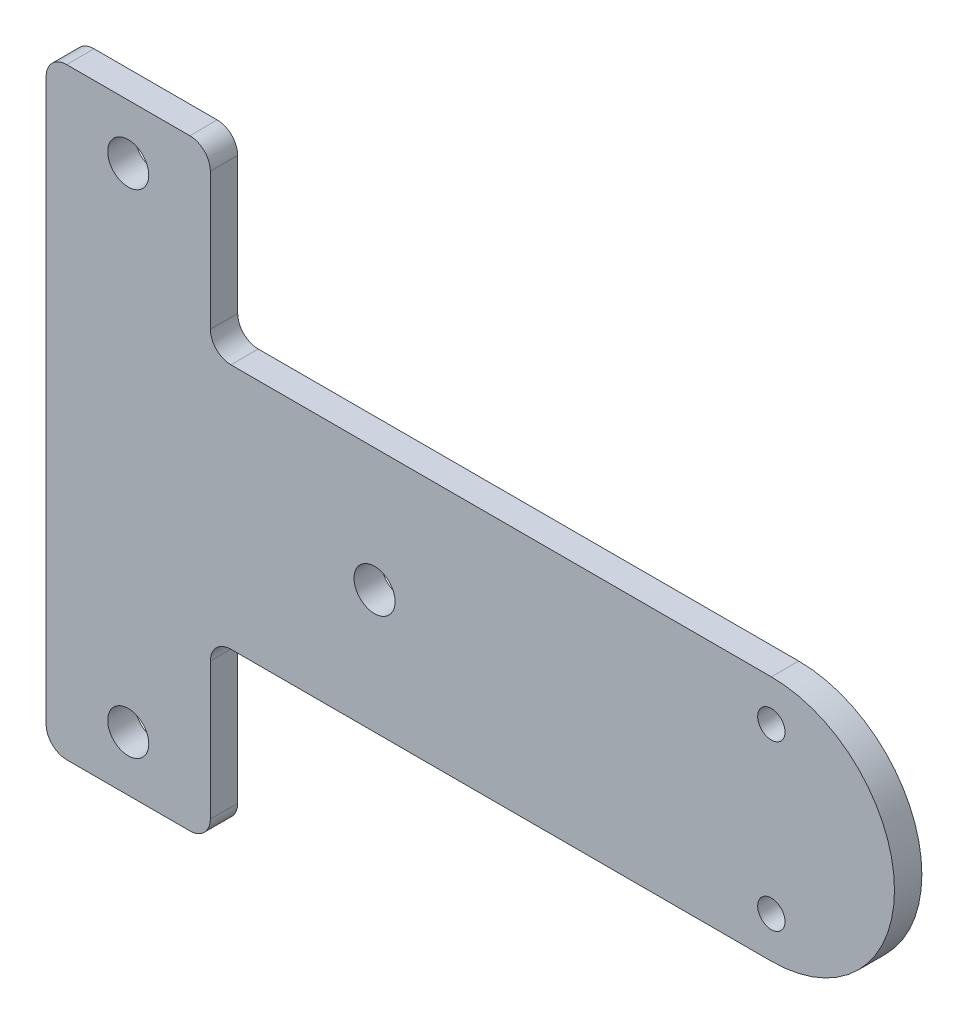
ISO-10303-21;
HEADER;
FILE_DESCRIPTION(('STEP AP214'),'2;1');
FILE_NAME('part.step','',(''),(''),'','','');
FILE_SCHEMA(('AUTOMOTIVE_DESIGN { 1 0 10303 214 1 1 1 1 }'));
ENDSEC;
DATA;
#1=APPLICATION_CONTEXT('core data for automotive mechanical design processes');
#2=APPLICATION_PROTOCOL_DEFINITION('international standard','automotive_design',2000,#1);
#3=PRODUCT_CONTEXT('',#1,'mechanical');
#4=PRODUCT('Part','Part','',(#3));
#5=PRODUCT_RELATED_PRODUCT_CATEGORY('part','',(#4));
#6=PRODUCT_DEFINITION_FORMATION('','',#4);
#7=PRODUCT_DEFINITION_CONTEXT('part definition',#1,'design');
#8=PRODUCT_DEFINITION('design','',#6,#7);
#9=PRODUCT_DEFINITION_SHAPE('','',#8);
#10=(LENGTH_UNIT() NAMED_UNIT(*) SI_UNIT(.MILLI.,.METRE.));
#11=(NAMED_UNIT(*) PLANE_ANGLE_UNIT() SI_UNIT($,.RADIAN.));
#12=(NAMED_UNIT(*) SI_UNIT($,.STERADIAN.) SOLID_ANGLE_UNIT());
#13=UNCERTAINTY_MEASURE_WITH_UNIT(LENGTH_MEASURE(1.E-05),#10,'distance_accuracy_value','');
#14=(GEOMETRIC_REPRESENTATION_CONTEXT(3) GLOBAL_UNCERTAINTY_ASSIGNED_CONTEXT((#13)) GLOBAL_UNIT_ASSIGNED_CONTEXT((#10,
#11,#12)) REPRESENTATION_CONTEXT('',''));
#15=CARTESIAN_POINT('',(0.,0.,0.));
#16=DIRECTION('',(0.,0.,1.));
#17=DIRECTION('',(1.,0.,0.));
#18=AXIS2_PLACEMENT_3D('',#15,#16,#17);
#19=CARTESIAN_POINT('',(-1.72357142857142,-4.3699119953848,2.));
#20=DIRECTION('',(0.,0.,-1.));
#21=DIRECTION('',(-1.,0.,0.));
#22=AXIS2_PLACEMENT_3D('',#19,#20,#21);
#23=CYLINDRICAL_SURFACE('',#22,9.);
#24=CARTESIAN_POINT('',(-1.72357142857142,-4.3699119953848,0.));
#25=DIRECTION('',(0.,0.,1.));
#26=DIRECTION('',(1.,0.,0.));
#27=AXIS2_PLACEMENT_3D('',#24,#25,#26);
#28=CIRCLE('',#27,9.);
#29=CARTESIAN_POINT('',(-1.72357142857142,4.63008800461521,0.));
#30=VERTEX_POINT('',#29);
#31=CARTESIAN_POINT('',(-1.72357142857142,-13.3699119953848,0.));
#32=VERTEX_POINT('',#31);
#33=EDGE_CURVE('E144',#30,#32,#28,.F.);
#34=ORIENTED_EDGE('',*,*,#33,.F.);
#35=DIRECTION('',(0.,0.,-1.));
#36=VECTOR('',#35,1.);
#37=CARTESIAN_POINT('',(-1.72357142857142,4.63008800461521,2.));
#38=LINE('',#37,#36);
#39=CARTESIAN_POINT('',(-1.72357142857142,4.63008800461521,2.));
#40=VERTEX_POINT('',#39);
#41=EDGE_CURVE('E139',#40,#30,#38,.T.);
#42=ORIENTED_EDGE('',*,*,#41,.F.);
#43=CARTESIAN_POINT('',(-1.72357142857142,-4.3699119953848,2.));
#44=DIRECTION('',(0.,0.,1.));
#45=DIRECTION('',(1.,0.,0.));
#46=AXIS2_PLACEMENT_3D('',#43,#44,#45);
#47=CIRCLE('',#46,9.);
#48=CARTESIAN_POINT('',(-1.72357142857142,-13.3699119953848,2.));
#49=VERTEX_POINT('',#48);
#50=EDGE_CURVE('E142',#40,#49,#47,.F.);
#51=ORIENTED_EDGE('',*,*,#50,.T.);
#52=DIRECTION('',(0.,0.,-1.));
#53=VECTOR('',#52,1.);
#54=CARTESIAN_POINT('',(-1.72357142857142,-13.3699119953848,2.));
#55=LINE('',#54,#53);
#56=EDGE_CURVE('E149',#49,#32,#55,.T.);
#57=ORIENTED_EDGE('',*,*,#56,.T.);
#58=EDGE_LOOP('',(#34,#42,#51,#57));
#59=FACE_BOUND('',#58,.T.);
#60=ADVANCED_FACE('F37',(#59),#23,.T.);
#61=CARTESIAN_POINT('',(0.,4.63008800461521,2.));
#62=DIRECTION('',(0.,-1.,0.));
#63=DIRECTION('',(1.,0.,0.));
#64=AXIS2_PLACEMENT_3D('',#61,#62,#63);
#65=PLANE('',#64);
#66=DIRECTION('',(-1.,0.,0.));
#67=VECTOR('',#66,1.);
#68=CARTESIAN_POINT('',(0.,4.63008800461521,0.));
#69=LINE('',#68,#67);
#70=CARTESIAN_POINT('',(-41.2235714285714,4.6300880046152,0.));
#71=VERTEX_POINT('',#70);
#72=EDGE_CURVE('E199',#30,#71,#69,.T.);
#73=ORIENTED_EDGE('',*,*,#72,.T.);
#74=DIRECTION('',(0.,0.,-1.));
#75=VECTOR('',#74,1.);
#76=CARTESIAN_POINT('',(-41.2235714285714,4.6300880046152,2.));
#77=LINE('',#76,#75);
#78=CARTESIAN_POINT('',(-41.2235714285714,4.6300880046152,2.));
#79=VERTEX_POINT('',#78);
#80=EDGE_CURVE('E155',#71,#79,#77,.F.);
#81=ORIENTED_EDGE('',*,*,#80,.T.);
#82=DIRECTION('',(-1.,0.,0.));
#83=VECTOR('',#82,1.);
#84=CARTESIAN_POINT('',(0.,4.63008800461521,2.));
#85=LINE('',#84,#83);
#86=EDGE_CURVE('E152',#40,#79,#85,.T.);
#87=ORIENTED_EDGE('',*,*,#86,.F.);
#88=ORIENTED_EDGE('',*,*,#41,.T.);
#89=EDGE_LOOP('',(#73,#81,#87,#88));
#90=FACE_BOUND('',#89,.T.);
#91=ADVANCED_FACE('F153',(#90),#65,.F.);
#92=CARTESIAN_POINT('',(-42.7235714285714,0.,2.));
#93=DIRECTION('',(-1.,0.,0.));
#94=DIRECTION('',(0.,0.,1.));
#95=AXIS2_PLACEMENT_3D('',#92,#93,#94);
#96=PLANE('',#95);
#97=DIRECTION('',(0.,1.,0.));
#98=VECTOR('',#97,1.);
#99=CARTESIAN_POINT('',(-42.7235714285714,0.,0.));
#100=LINE('',#99,#98);
#101=CARTESIAN_POINT('',(-42.7235714285714,6.1300880046152,0.));
#102=VERTEX_POINT('',#101);
#103=CARTESIAN_POINT('',(-42.7235714285714,16.1300880046152,0.));
#104=VERTEX_POINT('',#103);
#105=EDGE_CURVE('E201',#102,#104,#100,.T.);
#106=ORIENTED_EDGE('',*,*,#105,.T.);
#107=DIRECTION('',(0.,0.,-1.));
#108=VECTOR('',#107,1.);
#109=CARTESIAN_POINT('',(-42.7235714285714,16.1300880046152,2.));
#110=LINE('',#109,#108);
#111=CARTESIAN_POINT('',(-42.7235714285714,16.1300880046152,2.));
#112=VERTEX_POINT('',#111);
#113=EDGE_CURVE('E256',#104,#112,#110,.F.);
#114=ORIENTED_EDGE('',*,*,#113,.T.);
#115=DIRECTION('',(0.,1.,0.));
#116=VECTOR('',#115,1.);
#117=CARTESIAN_POINT('',(-42.7235714285714,0.,2.));
#118=LINE('',#117,#116);
#119=CARTESIAN_POINT('',(-42.7235714285714,6.1300880046152,2.));
#120=VERTEX_POINT('',#119);
#121=EDGE_CURVE('E157',#120,#112,#118,.T.);
#122=ORIENTED_EDGE('',*,*,#121,.F.);
#123=DIRECTION('',(0.,0.,-1.));
#124=VECTOR('',#123,1.);
#125=CARTESIAN_POINT('',(-42.7235714285714,6.1300880046152,0.));
#126=LINE('',#125,#124);
#127=EDGE_CURVE('E253',#120,#102,#126,.T.);
#128=ORIENTED_EDGE('',*,*,#127,.T.);
#129=EDGE_LOOP('',(#106,#114,#122,#128));
#130=FACE_BOUND('',#129,.T.);
#131=ADVANCED_FACE('F294',(#130),#96,.F.);
#132=CARTESIAN_POINT('',(0.,17.6300880046152,2.));
#133=DIRECTION('',(0.,-1.,0.));
#134=DIRECTION('',(0.,0.,-1.));
#135=AXIS2_PLACEMENT_3D('',#132,#133,#134);
#136=PLANE('',#135);
#137=DIRECTION('',(-1.,0.,0.));
#138=VECTOR('',#137,1.);
#139=CARTESIAN_POINT('',(0.,17.6300880046152,0.));
#140=LINE('',#139,#138);
#141=CARTESIAN_POINT('',(-44.2235714285714,17.6300880046152,0.));
#142=VERTEX_POINT('',#141);
#143=CARTESIAN_POINT('',(-53.2235714285714,17.6300880046152,0.));
#144=VERTEX_POINT('',#143);
#145=EDGE_CURVE('E204',#142,#144,#140,.T.);
#146=ORIENTED_EDGE('',*,*,#145,.T.);
#147=DIRECTION('',(0.,0.,-1.));
#148=VECTOR('',#147,1.);
#149=CARTESIAN_POINT('',(-53.2235714285714,17.6300880046152,2.));
#150=LINE('',#149,#148);
#151=CARTESIAN_POINT('',(-53.2235714285714,17.6300880046152,2.));
#152=VERTEX_POINT('',#151);
#153=EDGE_CURVE('E243',#144,#152,#150,.F.);
#154=ORIENTED_EDGE('',*,*,#153,.T.);
#155=DIRECTION('',(-1.,0.,0.));
#156=VECTOR('',#155,1.);
#157=CARTESIAN_POINT('',(0.,17.6300880046152,2.));
#158=LINE('',#157,#156);
#159=CARTESIAN_POINT('',(-44.2235714285714,17.6300880046152,2.));
#160=VERTEX_POINT('',#159);
#161=EDGE_CURVE('E172',#160,#152,#158,.T.);
#162=ORIENTED_EDGE('',*,*,#161,.F.);
#163=DIRECTION('',(0.,0.,-1.));
#164=VECTOR('',#163,1.);
#165=CARTESIAN_POINT('',(-44.2235714285714,17.6300880046152,2.));
#166=LINE('',#165,#164);
#167=EDGE_CURVE('E240',#160,#142,#166,.T.);
#168=ORIENTED_EDGE('',*,*,#167,.T.);
#169=EDGE_LOOP('',(#146,#154,#162,#168));
#170=FACE_BOUND('',#169,.T.);
#171=ADVANCED_FACE('F302',(#170),#136,.F.);
#172=CARTESIAN_POINT('',(-54.7235714285714,0.,2.));
#173=DIRECTION('',(1.,0.,0.));
#174=DIRECTION('',(0.,0.,-1.));
#175=AXIS2_PLACEMENT_3D('',#172,#173,#174);
#176=PLANE('',#175);
#177=DIRECTION('',(0.,-1.,0.));
#178=VECTOR('',#177,1.);
#179=CARTESIAN_POINT('',(-54.7235714285714,0.,2.));
#180=LINE('',#179,#178);
#181=CARTESIAN_POINT('',(-54.7235714285714,16.1300880046152,2.));
#182=VERTEX_POINT('',#181);
#183=CARTESIAN_POINT('',(-54.7235714285714,-24.8699119953848,2.));
#184=VERTEX_POINT('',#183);
#185=EDGE_CURVE('E174',#182,#184,#180,.T.);
#186=ORIENTED_EDGE('',*,*,#185,.F.);
#187=DIRECTION('',(0.,0.,-1.));
#188=VECTOR('',#187,1.);
#189=CARTESIAN_POINT('',(-54.7235714285714,16.1300880046152,2.));
#190=LINE('',#189,#188);
#191=CARTESIAN_POINT('',(-54.7235714285714,16.1300880046152,0.));
#192=VERTEX_POINT('',#191);
#193=EDGE_CURVE('E229',#182,#192,#190,.T.);
#194=ORIENTED_EDGE('',*,*,#193,.T.);
#195=DIRECTION('',(0.,-1.,0.));
#196=VECTOR('',#195,1.);
#197=CARTESIAN_POINT('',(-54.7235714285714,0.,0.));
#198=LINE('',#197,#196);
#199=CARTESIAN_POINT('',(-54.7235714285714,-24.8699119953848,0.));
#200=VERTEX_POINT('',#199);
#201=EDGE_CURVE('E207',#192,#200,#198,.T.);
#202=ORIENTED_EDGE('',*,*,#201,.T.);
#203=DIRECTION('',(0.,0.,-1.));
#204=VECTOR('',#203,1.);
#205=CARTESIAN_POINT('',(-54.7235714285714,-24.8699119953848,2.));
#206=LINE('',#205,#204);
#207=EDGE_CURVE('E148',#200,#184,#206,.F.);
#208=ORIENTED_EDGE('',*,*,#207,.T.);
#209=EDGE_LOOP('',(#186,#194,#202,#208));
#210=FACE_BOUND('',#209,.T.);
#211=ADVANCED_FACE('F311',(#210),#176,.F.);
#212=CARTESIAN_POINT('',(0.,-26.3699119953848,2.));
#213=DIRECTION('',(0.,1.,0.));
#214=DIRECTION('',(0.,0.,1.));
#215=AXIS2_PLACEMENT_3D('',#212,#213,#214);
#216=PLANE('',#215);
#217=DIRECTION('',(1.,0.,0.));
#218=VECTOR('',#217,1.);
#219=CARTESIAN_POINT('',(0.,-26.3699119953848,0.));
#220=LINE('',#219,#218);
#221=CARTESIAN_POINT('',(-53.2235714285714,-26.3699119953848,0.));
#222=VERTEX_POINT('',#221);
#223=CARTESIAN_POINT('',(-44.2235714285714,-26.3699119953848,0.));
#224=VERTEX_POINT('',#223);
#225=EDGE_CURVE('E210',#222,#224,#220,.T.);
#226=ORIENTED_EDGE('',*,*,#225,.T.);
#227=DIRECTION('',(0.,0.,-1.));
#228=VECTOR('',#227,1.);
#229=CARTESIAN_POINT('',(-44.2235714285714,-26.3699119953848,2.));
#230=LINE('',#229,#228);
#231=CARTESIAN_POINT('',(-44.2235714285714,-26.3699119953848,2.));
#232=VERTEX_POINT('',#231);
#233=EDGE_CURVE('E269',#224,#232,#230,.F.);
#234=ORIENTED_EDGE('',*,*,#233,.T.);
#235=DIRECTION('',(1.,0.,0.));
#236=VECTOR('',#235,1.);
#237=CARTESIAN_POINT('',(0.,-26.3699119953848,2.));
#238=LINE('',#237,#236);
#239=CARTESIAN_POINT('',(-53.2235714285714,-26.3699119953848,2.));
#240=VERTEX_POINT('',#239);
#241=EDGE_CURVE('E177',#240,#232,#238,.T.);
#242=ORIENTED_EDGE('',*,*,#241,.F.);
#243=DIRECTION('',(0.,0.,-1.));
#244=VECTOR('',#243,1.);
#245=CARTESIAN_POINT('',(-53.2235714285714,-26.3699119953848,2.));
#246=LINE('',#245,#244);
#247=EDGE_CURVE('E266',#240,#222,#246,.T.);
#248=ORIENTED_EDGE('',*,*,#247,.T.);
#249=EDGE_LOOP('',(#226,#234,#242,#248));
#250=FACE_BOUND('',#249,.T.);
#251=ADVANCED_FACE('F318',(#250),#216,.F.);
#252=CARTESIAN_POINT('',(-42.7235714285714,0.,2.));
#253=DIRECTION('',(-1.,0.,0.));
#254=DIRECTION('',(0.,-1.,0.));
#255=AXIS2_PLACEMENT_3D('',#252,#253,#254);
#256=PLANE('',#255);
#257=DIRECTION('',(0.,1.,0.));
#258=VECTOR('',#257,1.);
#259=CARTESIAN_POINT('',(-42.7235714285714,0.,0.));
#260=LINE('',#259,#258);
#261=CARTESIAN_POINT('',(-42.7235714285714,-24.8699119953848,0.));
#262=VERTEX_POINT('',#261);
#263=CARTESIAN_POINT('',(-42.7235714285714,-14.8699119953848,0.));
#264=VERTEX_POINT('',#263);
#265=EDGE_CURVE('E213',#262,#264,#260,.T.);
#266=ORIENTED_EDGE('',*,*,#265,.T.);
#267=DIRECTION('',(0.,0.,-1.));
#268=VECTOR('',#267,1.);
#269=CARTESIAN_POINT('',(-42.7235714285714,-14.8699119953848,2.));
#270=LINE('',#269,#268);
#271=CARTESIAN_POINT('',(-42.7235714285714,-14.8699119953848,2.));
#272=VERTEX_POINT('',#271);
#273=EDGE_CURVE('E58',#264,#272,#270,.F.);
#274=ORIENTED_EDGE('',*,*,#273,.T.);
#275=DIRECTION('',(0.,1.,0.));
#276=VECTOR('',#275,1.);
#277=CARTESIAN_POINT('',(-42.7235714285714,0.,2.));
#278=LINE('',#277,#276);
#279=CARTESIAN_POINT('',(-42.7235714285714,-24.8699119953848,2.));
#280=VERTEX_POINT('',#279);
#281=EDGE_CURVE('E180',#280,#272,#278,.T.);
#282=ORIENTED_EDGE('',*,*,#281,.F.);
#283=DIRECTION('',(0.,0.,-1.));
#284=VECTOR('',#283,1.);
#285=CARTESIAN_POINT('',(-42.7235714285714,-24.8699119953848,2.));
#286=LINE('',#285,#284);
#287=EDGE_CURVE('E262',#280,#262,#286,.T.);
#288=ORIENTED_EDGE('',*,*,#287,.T.);
#289=EDGE_LOOP('',(#266,#274,#282,#288));
#290=FACE_BOUND('',#289,.T.);
#291=ADVANCED_FACE('F282',(#290),#256,.F.);
#292=CARTESIAN_POINT('',(-48.7235714285714,13.6300880046152,2.));
#293=DIRECTION('',(0.,0.,-1.));
#294=DIRECTION('',(-1.,0.,0.));
#295=AXIS2_PLACEMENT_3D('',#292,#293,#294);
#296=CYLINDRICAL_SURFACE('',#295,1.5);
#297=CARTESIAN_POINT('',(-48.7235714285714,13.6300880046152,2.));
#298=DIRECTION('',(0.,0.,1.));
#299=DIRECTION('',(1.,0.,0.));
#300=AXIS2_PLACEMENT_3D('',#297,#298,#299);
#301=CIRCLE('',#300,1.5);
#302=CARTESIAN_POINT('',(-47.2235714285714,13.6300880046152,2.));
#303=VERTEX_POINT('',#302);
#304=EDGE_CURVE('E186',#303,#303,#301,.T.);
#305=ORIENTED_EDGE('',*,*,#304,.T.);
#306=EDGE_LOOP('',(#305));
#307=FACE_BOUND('',#306,.T.);
#308=CARTESIAN_POINT('',(-48.7235714285714,13.6300880046152,0.));
#309=DIRECTION('',(0.,0.,1.));
#310=DIRECTION('',(1.,0.,0.));
#311=AXIS2_PLACEMENT_3D('',#308,#309,#310);
#312=CIRCLE('',#311,1.5);
#313=CARTESIAN_POINT('',(-47.2235714285714,13.6300880046152,0.));
#314=VERTEX_POINT('',#313);
#315=EDGE_CURVE('E221',#314,#314,#312,.T.);
#316=ORIENTED_EDGE('',*,*,#315,.F.);
#317=EDGE_LOOP('',(#316));
#318=FACE_BOUND('',#317,.T.);
#319=ADVANCED_FACE('F434',(#307,#318),#296,.F.);
#320=CARTESIAN_POINT('',(-30.7235714285714,-4.3699119953848,2.));
#321=DIRECTION('',(0.,0.,-1.));
#322=DIRECTION('',(-1.,0.,0.));
#323=AXIS2_PLACEMENT_3D('',#320,#321,#322);
#324=CYLINDRICAL_SURFACE('',#323,1.5);
#325=CARTESIAN_POINT('',(-30.7235714285714,-4.3699119953848,2.));
#326=DIRECTION('',(0.,0.,1.));
#327=DIRECTION('',(1.,0.,0.));
#328=AXIS2_PLACEMENT_3D('',#325,#326,#327);
#329=CIRCLE('',#328,1.5);
#330=CARTESIAN_POINT('',(-29.2235714285714,-4.3699119953848,2.));
#331=VERTEX_POINT('',#330);
#332=EDGE_CURVE('E183',#331,#331,#329,.T.);
#333=ORIENTED_EDGE('',*,*,#332,.T.);
#334=EDGE_LOOP('',(#333));
#335=FACE_BOUND('',#334,.T.);
#336=CARTESIAN_POINT('',(-30.7235714285714,-4.3699119953848,0.));
#337=DIRECTION('',(0.,0.,1.));
#338=DIRECTION('',(1.,0.,0.));
#339=AXIS2_PLACEMENT_3D('',#336,#337,#338);
#340=CIRCLE('',#339,1.5);
#341=CARTESIAN_POINT('',(-29.2235714285714,-4.3699119953848,0.));
#342=VERTEX_POINT('',#341);
#343=EDGE_CURVE('E218',#342,#342,#340,.T.);
#344=ORIENTED_EDGE('',*,*,#343,.F.);
#345=EDGE_LOOP('',(#344));
#346=FACE_BOUND('',#345,.T.);
#347=ADVANCED_FACE('F426',(#335,#346),#324,.F.);
#348=CARTESIAN_POINT('',(0.,-13.3699119953848,2.));
#349=DIRECTION('',(0.,-1.,0.));
#350=DIRECTION('',(1.,0.,0.));
#351=AXIS2_PLACEMENT_3D('',#348,#349,#350);
#352=PLANE('',#351);
#353=DIRECTION('',(-1.,0.,0.));
#354=VECTOR('',#353,1.);
#355=CARTESIAN_POINT('',(0.,-13.3699119953848,2.));
#356=LINE('',#355,#354);
#357=CARTESIAN_POINT('',(-41.2235714285714,-13.3699119953848,2.));
#358=VERTEX_POINT('',#357);
#359=EDGE_CURVE('E162',#49,#358,#356,.T.);
#360=ORIENTED_EDGE('',*,*,#359,.T.);
#361=DIRECTION('',(0.,0.,-1.));
#362=VECTOR('',#361,1.);
#363=CARTESIAN_POINT('',(-41.2235714285714,-13.3699119953848,2.));
#364=LINE('',#363,#362);
#365=CARTESIAN_POINT('',(-41.2235714285714,-13.3699119953848,0.));
#366=VERTEX_POINT('',#365);
#367=EDGE_CURVE('E259',#358,#366,#364,.T.);
#368=ORIENTED_EDGE('',*,*,#367,.T.);
#369=DIRECTION('',(-1.,0.,0.));
#370=VECTOR('',#369,1.);
#371=CARTESIAN_POINT('',(0.,-13.3699119953848,0.));
#372=LINE('',#371,#370);
#373=EDGE_CURVE('E215',#32,#366,#372,.T.);
#374=ORIENTED_EDGE('',*,*,#373,.F.);
#375=ORIENTED_EDGE('',*,*,#56,.F.);
#376=EDGE_LOOP('',(#360,#368,#374,#375));
#377=FACE_BOUND('',#376,.T.);
#378=ADVANCED_FACE('F286',(#377),#352,.T.);
#379=CARTESIAN_POINT('',(-1.72357142857141,-10.3699119953848,2.));
#380=DIRECTION('',(0.,0.,-1.));
#381=DIRECTION('',(-1.,0.,0.));
#382=AXIS2_PLACEMENT_3D('',#379,#380,#381);
#383=CYLINDRICAL_SURFACE('',#382,1.);
#384=CARTESIAN_POINT('',(-1.72357142857141,-10.3699119953848,2.));
#385=DIRECTION('',(0.,0.,1.));
#386=DIRECTION('',(1.,0.,0.));
#387=AXIS2_PLACEMENT_3D('',#384,#385,#386);
#388=CIRCLE('',#387,1.);
#389=CARTESIAN_POINT('',(-0.723571428571409,-10.3699119953848,2.));
#390=VERTEX_POINT('',#389);
#391=EDGE_CURVE('E163',#390,#390,#388,.T.);
#392=ORIENTED_EDGE('',*,*,#391,.T.);
#393=EDGE_LOOP('',(#392));
#394=FACE_BOUND('',#393,.T.);
#395=CARTESIAN_POINT('',(-1.72357142857141,-10.3699119953848,0.));
#396=DIRECTION('',(0.,0.,1.));
#397=DIRECTION('',(1.,0.,0.));
#398=AXIS2_PLACEMENT_3D('',#395,#396,#397);
#399=CIRCLE('',#398,1.);
#400=CARTESIAN_POINT('',(-0.723571428571409,-10.3699119953848,0.));
#401=VERTEX_POINT('',#400);
#402=EDGE_CURVE('E195',#401,#401,#399,.T.);
#403=ORIENTED_EDGE('',*,*,#402,.F.);
#404=EDGE_LOOP('',(#403));
#405=FACE_BOUND('',#404,.T.);
#406=ADVANCED_FACE('F337',(#394,#405),#383,.F.);
#407=CARTESIAN_POINT('',(-1.72357142857142,1.63008800461521,2.));
#408=DIRECTION('',(0.,0.,-1.));
#409=DIRECTION('',(-1.,0.,0.));
#410=AXIS2_PLACEMENT_3D('',#407,#408,#409);
#411=CYLINDRICAL_SURFACE('',#410,0.999999999999998);
#412=CARTESIAN_POINT('',(-1.72357142857142,1.63008800461521,2.));
#413=DIRECTION('',(0.,0.,1.));
#414=DIRECTION('',(1.,0.,0.));
#415=AXIS2_PLACEMENT_3D('',#412,#413,#414);
#416=CIRCLE('',#415,0.999999999999998);
#417=CARTESIAN_POINT('',(-0.72357142857142,1.63008800461521,2.));
#418=VERTEX_POINT('',#417);
#419=EDGE_CURVE('E166',#418,#418,#416,.T.);
#420=ORIENTED_EDGE('',*,*,#419,.T.);
#421=EDGE_LOOP('',(#420));
#422=FACE_BOUND('',#421,.T.);
#423=CARTESIAN_POINT('',(-1.72357142857142,1.63008800461521,0.));
#424=DIRECTION('',(0.,0.,1.));
#425=DIRECTION('',(1.,0.,0.));
#426=AXIS2_PLACEMENT_3D('',#423,#424,#425);
#427=CIRCLE('',#426,0.999999999999998);
#428=CARTESIAN_POINT('',(-0.72357142857142,1.63008800461521,0.));
#429=VERTEX_POINT('',#428);
#430=EDGE_CURVE('E192',#429,#429,#427,.T.);
#431=ORIENTED_EDGE('',*,*,#430,.F.);
#432=EDGE_LOOP('',(#431));
#433=FACE_BOUND('',#432,.T.);
#434=ADVANCED_FACE('F340',(#422,#433),#411,.F.);
#435=CARTESIAN_POINT('',(-48.7235714285714,-22.3699119953848,2.));
#436=DIRECTION('',(0.,0.,-1.));
#437=DIRECTION('',(-1.,0.,0.));
#438=AXIS2_PLACEMENT_3D('',#435,#436,#437);
#439=CYLINDRICAL_SURFACE('',#438,1.5);
#440=CARTESIAN_POINT('',(-48.7235714285714,-22.3699119953848,2.));
#441=DIRECTION('',(0.,0.,1.));
#442=DIRECTION('',(1.,0.,0.));
#443=AXIS2_PLACEMENT_3D('',#440,#441,#442);
#444=CIRCLE('',#443,1.5);
#445=CARTESIAN_POINT('',(-47.2235714285714,-22.3699119953848,2.));
#446=VERTEX_POINT('',#445);
#447=EDGE_CURVE('E189',#446,#446,#444,.F.);
#448=ORIENTED_EDGE('',*,*,#447,.F.);
#449=EDGE_LOOP('',(#448));
#450=FACE_BOUND('',#449,.T.);
#451=CARTESIAN_POINT('',(-48.7235714285714,-22.3699119953848,0.));
#452=DIRECTION('',(0.,0.,1.));
#453=DIRECTION('',(1.,0.,0.));
#454=AXIS2_PLACEMENT_3D('',#451,#452,#453);
#455=CIRCLE('',#454,1.5);
#456=CARTESIAN_POINT('',(-47.2235714285714,-22.3699119953848,0.));
#457=VERTEX_POINT('',#456);
#458=EDGE_CURVE('E224',#457,#457,#455,.F.);
#459=ORIENTED_EDGE('',*,*,#458,.T.);
#460=EDGE_LOOP('',(#459));
#461=FACE_BOUND('',#460,.T.);
#462=ADVANCED_FACE('F344',(#450,#461),#439,.F.);
#463=CARTESIAN_POINT('',(0.,0.,2.));
#464=DIRECTION('',(0.,0.,1.));
#465=DIRECTION('',(1.,0.,0.));
#466=AXIS2_PLACEMENT_3D('',#463,#464,#465);
#467=PLANE('',#466);
#468=ORIENTED_EDGE('',*,*,#419,.F.);
#469=EDGE_LOOP('',(#468));
#470=FACE_BOUND('',#469,.T.);
#471=ORIENTED_EDGE('',*,*,#391,.F.);
#472=EDGE_LOOP('',(#471));
#473=FACE_BOUND('',#472,.T.);
#474=ORIENTED_EDGE('',*,*,#161,.T.);
#475=CARTESIAN_POINT('',(-53.2235714285714,16.1300880046152,2.));
#476=DIRECTION('',(0.,0.,1.));
#477=DIRECTION('',(1.,0.,0.));
#478=AXIS2_PLACEMENT_3D('',#475,#476,#477);
#479=CIRCLE('',#478,1.5);
#480=EDGE_CURVE('E251',#152,#182,#479,.T.);
#481=ORIENTED_EDGE('',*,*,#480,.T.);
#482=ORIENTED_EDGE('',*,*,#185,.T.);
#483=CARTESIAN_POINT('',(-53.2235714285714,-24.8699119953848,2.));
#484=DIRECTION('',(0.,0.,1.));
#485=DIRECTION('',(1.,0.,0.));
#486=AXIS2_PLACEMENT_3D('',#483,#484,#485);
#487=CIRCLE('',#486,1.5);
#488=EDGE_CURVE('E245',#184,#240,#487,.T.);
#489=ORIENTED_EDGE('',*,*,#488,.T.);
#490=ORIENTED_EDGE('',*,*,#241,.T.);
#491=CARTESIAN_POINT('',(-44.2235714285714,-24.8699119953848,2.));
#492=DIRECTION('',(0.,0.,1.));
#493=DIRECTION('',(1.,0.,0.));
#494=AXIS2_PLACEMENT_3D('',#491,#492,#493);
#495=CIRCLE('',#494,1.5);
#496=EDGE_CURVE('E247',#232,#280,#495,.T.);
#497=ORIENTED_EDGE('',*,*,#496,.T.);
#498=ORIENTED_EDGE('',*,*,#281,.T.);
#499=CARTESIAN_POINT('',(-41.2235714285714,-14.8699119953848,2.));
#500=DIRECTION('',(0.,0.,1.));
#501=DIRECTION('',(1.,0.,0.));
#502=AXIS2_PLACEMENT_3D('',#499,#500,#501);
#503=CIRCLE('',#502,1.5);
#504=EDGE_CURVE('E11',#272,#358,#503,.F.);
#505=ORIENTED_EDGE('',*,*,#504,.T.);
#506=ORIENTED_EDGE('',*,*,#359,.F.);
#507=ORIENTED_EDGE('',*,*,#50,.F.);
#508=ORIENTED_EDGE('',*,*,#86,.T.);
#509=CARTESIAN_POINT('',(-41.2235714285714,6.1300880046152,2.));
#510=DIRECTION('',(0.,0.,1.));
#511=DIRECTION('',(1.,0.,0.));
#512=AXIS2_PLACEMENT_3D('',#509,#510,#511);
#513=CIRCLE('',#512,1.5);
#514=EDGE_CURVE('E273',#79,#120,#513,.F.);
#515=ORIENTED_EDGE('',*,*,#514,.T.);
#516=ORIENTED_EDGE('',*,*,#121,.T.);
#517=CARTESIAN_POINT('',(-44.2235714285714,16.1300880046152,2.));
#518=DIRECTION('',(0.,0.,1.));
#519=DIRECTION('',(1.,0.,0.));
#520=AXIS2_PLACEMENT_3D('',#517,#518,#519);
#521=CIRCLE('',#520,1.5);
#522=EDGE_CURVE('E249',#112,#160,#521,.T.);
#523=ORIENTED_EDGE('',*,*,#522,.T.);
#524=EDGE_LOOP('',(#474,#481,#482,#489,#490,#497,#498,#505,#506,#507,#508,#515,#516,#523));
#525=FACE_BOUND('',#524,.T.);
#526=ORIENTED_EDGE('',*,*,#332,.F.);
#527=EDGE_LOOP('',(#526));
#528=FACE_BOUND('',#527,.T.);
#529=ORIENTED_EDGE('',*,*,#304,.F.);
#530=EDGE_LOOP('',(#529));
#531=FACE_BOUND('',#530,.T.);
#532=ORIENTED_EDGE('',*,*,#447,.T.);
#533=EDGE_LOOP('',(#532));
#534=FACE_BOUND('',#533,.T.);
#535=ADVANCED_FACE('F160',(#470,#473,#525,#528,#531,#534),#467,.T.);
#536=CARTESIAN_POINT('',(0.,0.,0.));
#537=DIRECTION('',(0.,0.,1.));
#538=DIRECTION('',(1.,0.,0.));
#539=AXIS2_PLACEMENT_3D('',#536,#537,#538);
#540=PLANE('',#539);
#541=ORIENTED_EDGE('',*,*,#430,.T.);
#542=EDGE_LOOP('',(#541));
#543=FACE_BOUND('',#542,.T.);
#544=ORIENTED_EDGE('',*,*,#402,.T.);
#545=EDGE_LOOP('',(#544));
#546=FACE_BOUND('',#545,.T.);
#547=ORIENTED_EDGE('',*,*,#201,.F.);
#548=CARTESIAN_POINT('',(-53.2235714285714,16.1300880046152,0.));
#549=DIRECTION('',(0.,0.,1.));
#550=DIRECTION('',(1.,0.,0.));
#551=AXIS2_PLACEMENT_3D('',#548,#549,#550);
#552=CIRCLE('',#551,1.5);
#553=EDGE_CURVE('E238',#192,#144,#552,.F.);
#554=ORIENTED_EDGE('',*,*,#553,.T.);
#555=ORIENTED_EDGE('',*,*,#145,.F.);
#556=CARTESIAN_POINT('',(-44.2235714285714,16.1300880046152,0.));
#557=DIRECTION('',(0.,0.,1.));
#558=DIRECTION('',(1.,0.,0.));
#559=AXIS2_PLACEMENT_3D('',#556,#557,#558);
#560=CIRCLE('',#559,1.5);
#561=EDGE_CURVE('E236',#142,#104,#560,.F.);
#562=ORIENTED_EDGE('',*,*,#561,.T.);
#563=ORIENTED_EDGE('',*,*,#105,.F.);
#564=CARTESIAN_POINT('',(-41.2235714285714,6.1300880046152,0.));
#565=DIRECTION('',(0.,0.,1.));
#566=DIRECTION('',(1.,0.,0.));
#567=AXIS2_PLACEMENT_3D('',#564,#565,#566);
#568=CIRCLE('',#567,1.5);
#569=EDGE_CURVE('E271',#102,#71,#568,.T.);
#570=ORIENTED_EDGE('',*,*,#569,.T.);
#571=ORIENTED_EDGE('',*,*,#72,.F.);
#572=ORIENTED_EDGE('',*,*,#33,.T.);
#573=ORIENTED_EDGE('',*,*,#373,.T.);
#574=CARTESIAN_POINT('',(-41.2235714285714,-14.8699119953848,0.));
#575=DIRECTION('',(0.,0.,1.));
#576=DIRECTION('',(1.,0.,0.));
#577=AXIS2_PLACEMENT_3D('',#574,#575,#576);
#578=CIRCLE('',#577,1.5);
#579=EDGE_CURVE('E45',#366,#264,#578,.T.);
#580=ORIENTED_EDGE('',*,*,#579,.T.);
#581=ORIENTED_EDGE('',*,*,#265,.F.);
#582=CARTESIAN_POINT('',(-44.2235714285714,-24.8699119953848,0.));
#583=DIRECTION('',(0.,0.,1.));
#584=DIRECTION('',(1.,0.,0.));
#585=AXIS2_PLACEMENT_3D('',#582,#583,#584);
#586=CIRCLE('',#585,1.5);
#587=EDGE_CURVE('E234',#262,#224,#586,.F.);
#588=ORIENTED_EDGE('',*,*,#587,.T.);
#589=ORIENTED_EDGE('',*,*,#225,.F.);
#590=CARTESIAN_POINT('',(-53.2235714285714,-24.8699119953848,0.));
#591=DIRECTION('',(0.,0.,1.));
#592=DIRECTION('',(1.,0.,0.));
#593=AXIS2_PLACEMENT_3D('',#590,#591,#592);
#594=CIRCLE('',#593,1.5);
#595=EDGE_CURVE('E232',#222,#200,#594,.F.);
#596=ORIENTED_EDGE('',*,*,#595,.T.);
#597=EDGE_LOOP('',(#547,#554,#555,#562,#563,#570,#571,#572,#573,#580,#581,#588,#589,#596));
#598=FACE_BOUND('',#597,.T.);
#599=ORIENTED_EDGE('',*,*,#343,.T.);
#600=EDGE_LOOP('',(#599));
#601=FACE_BOUND('',#600,.T.);
#602=ORIENTED_EDGE('',*,*,#315,.T.);
#603=EDGE_LOOP('',(#602));
#604=FACE_BOUND('',#603,.T.);
#605=ORIENTED_EDGE('',*,*,#458,.F.);
#606=EDGE_LOOP('',(#605));
#607=FACE_BOUND('',#606,.T.);
#608=ADVANCED_FACE('F277',(#543,#546,#598,#601,#604,#607),#540,.F.);
#609=CARTESIAN_POINT('',(-53.2235714285714,16.1300880046152,2.));
#610=DIRECTION('',(0.,0.,-1.));
#611=DIRECTION('',(-1.,0.,0.));
#612=AXIS2_PLACEMENT_3D('',#609,#610,#611);
#613=CYLINDRICAL_SURFACE('',#612,1.5);
#614=ORIENTED_EDGE('',*,*,#480,.F.);
#615=ORIENTED_EDGE('',*,*,#153,.F.);
#616=ORIENTED_EDGE('',*,*,#553,.F.);
#617=ORIENTED_EDGE('',*,*,#193,.F.);
#618=EDGE_LOOP('',(#614,#615,#616,#617));
#619=FACE_BOUND('',#618,.T.);
#620=ADVANCED_FACE('F306',(#619),#613,.T.);
#621=CARTESIAN_POINT('',(-44.2235714285714,16.1300880046152,2.));
#622=DIRECTION('',(0.,0.,-1.));
#623=DIRECTION('',(-1.,0.,0.));
#624=AXIS2_PLACEMENT_3D('',#621,#622,#623);
#625=CYLINDRICAL_SURFACE('',#624,1.5);
#626=ORIENTED_EDGE('',*,*,#522,.F.);
#627=ORIENTED_EDGE('',*,*,#113,.F.);
#628=ORIENTED_EDGE('',*,*,#561,.F.);
#629=ORIENTED_EDGE('',*,*,#167,.F.);
#630=EDGE_LOOP('',(#626,#627,#628,#629));
#631=FACE_BOUND('',#630,.T.);
#632=ADVANCED_FACE('F297',(#631),#625,.T.);
#633=CARTESIAN_POINT('',(-41.2235714285714,6.1300880046152,2.));
#634=DIRECTION('',(0.,0.,1.));
#635=DIRECTION('',(1.,0.,0.));
#636=AXIS2_PLACEMENT_3D('',#633,#634,#635);
#637=CYLINDRICAL_SURFACE('',#636,1.5);
#638=ORIENTED_EDGE('',*,*,#514,.F.);
#639=ORIENTED_EDGE('',*,*,#80,.F.);
#640=ORIENTED_EDGE('',*,*,#569,.F.);
#641=ORIENTED_EDGE('',*,*,#127,.F.);
#642=EDGE_LOOP('',(#638,#639,#640,#641));
#643=FACE_BOUND('',#642,.T.);
#644=ADVANCED_FACE('F289',(#643),#637,.F.);
#645=CARTESIAN_POINT('',(-41.2235714285714,-14.8699119953848,2.));
#646=DIRECTION('',(0.,0.,-1.));
#647=DIRECTION('',(-1.,0.,0.));
#648=AXIS2_PLACEMENT_3D('',#645,#646,#647);
#649=CYLINDRICAL_SURFACE('',#648,1.5);
#650=ORIENTED_EDGE('',*,*,#504,.F.);
#651=ORIENTED_EDGE('',*,*,#273,.F.);
#652=ORIENTED_EDGE('',*,*,#579,.F.);
#653=ORIENTED_EDGE('',*,*,#367,.F.);
#654=EDGE_LOOP('',(#650,#651,#652,#653));
#655=FACE_BOUND('',#654,.T.);
#656=ADVANCED_FACE('F284',(#655),#649,.F.);
#657=CARTESIAN_POINT('',(-44.2235714285714,-24.8699119953848,2.));
#658=DIRECTION('',(0.,0.,-1.));
#659=DIRECTION('',(-1.,0.,0.));
#660=AXIS2_PLACEMENT_3D('',#657,#658,#659);
#661=CYLINDRICAL_SURFACE('',#660,1.5);
#662=ORIENTED_EDGE('',*,*,#496,.F.);
#663=ORIENTED_EDGE('',*,*,#233,.F.);
#664=ORIENTED_EDGE('',*,*,#587,.F.);
#665=ORIENTED_EDGE('',*,*,#287,.F.);
#666=EDGE_LOOP('',(#662,#663,#664,#665));
#667=FACE_BOUND('',#666,.T.);
#668=ADVANCED_FACE('F322',(#667),#661,.T.);
#669=CARTESIAN_POINT('',(-53.2235714285714,-24.8699119953848,2.));
#670=DIRECTION('',(0.,0.,-1.));
#671=DIRECTION('',(-1.,0.,0.));
#672=AXIS2_PLACEMENT_3D('',#669,#670,#671);
#673=CYLINDRICAL_SURFACE('',#672,1.5);
#674=ORIENTED_EDGE('',*,*,#488,.F.);
#675=ORIENTED_EDGE('',*,*,#207,.F.);
#676=ORIENTED_EDGE('',*,*,#595,.F.);
#677=ORIENTED_EDGE('',*,*,#247,.F.);
#678=EDGE_LOOP('',(#674,#675,#676,#677));
#679=FACE_BOUND('',#678,.T.);
#680=ADVANCED_FACE('F39',(#679),#673,.T.);
#681=CLOSED_SHELL('',(#60,#91,#131,#171,#211,#251,#291,#319,#347,#378,#406,#434,#462,#535,#608,
#620,#632,#644,#656,#668,#680));
#682=MANIFOLD_SOLID_BREP('B2',#681);
#683=ADVANCED_BREP_SHAPE_REPRESENTATION('',(#18,#682),#14);
#684=SHAPE_DEFINITION_REPRESENTATION(#9,#683);
ENDSEC;
END-ISO-10303-21;
